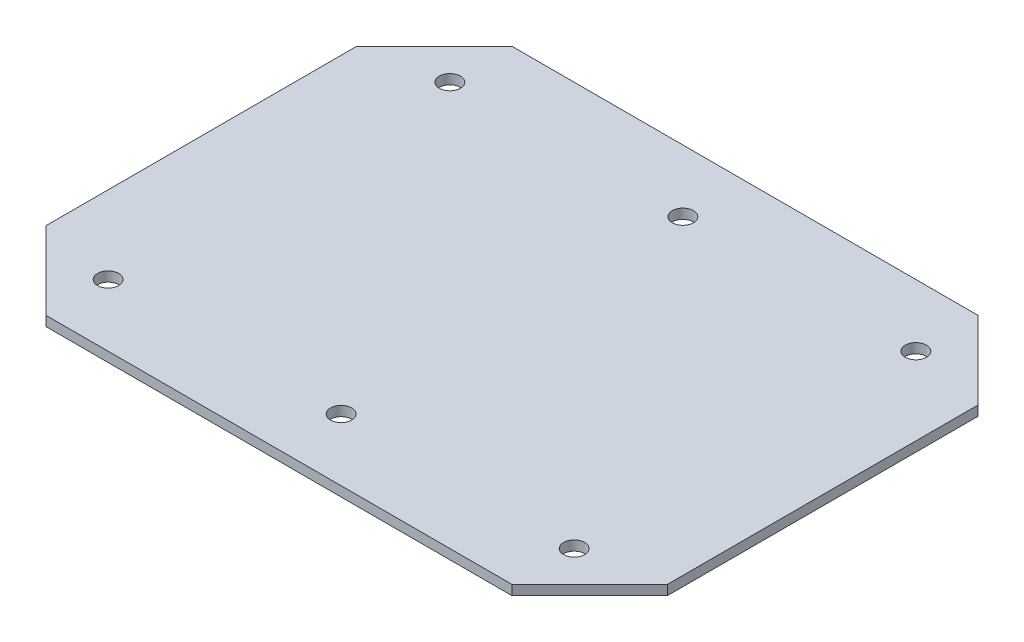
ISO-10303-21;
HEADER;
FILE_DESCRIPTION(('STEP AP214'),'2;1');
FILE_NAME('part.step','',(''),(''),'','','');
FILE_SCHEMA(('AUTOMOTIVE_DESIGN { 1 0 10303 214 1 1 1 1 }'));
ENDSEC;
DATA;
#1=APPLICATION_CONTEXT('core data for automotive mechanical design processes');
#2=APPLICATION_PROTOCOL_DEFINITION('international standard','automotive_design',2000,#1);
#3=PRODUCT_CONTEXT('',#1,'mechanical');
#4=PRODUCT('Part','Part','',(#3));
#5=PRODUCT_RELATED_PRODUCT_CATEGORY('part','',(#4));
#6=PRODUCT_DEFINITION_FORMATION('','',#4);
#7=PRODUCT_DEFINITION_CONTEXT('part definition',#1,'design');
#8=PRODUCT_DEFINITION('design','',#6,#7);
#9=PRODUCT_DEFINITION_SHAPE('','',#8);
#10=(LENGTH_UNIT() NAMED_UNIT(*) SI_UNIT(.MILLI.,.METRE.));
#11=(NAMED_UNIT(*) PLANE_ANGLE_UNIT() SI_UNIT($,.RADIAN.));
#12=(NAMED_UNIT(*) SI_UNIT($,.STERADIAN.) SOLID_ANGLE_UNIT());
#13=UNCERTAINTY_MEASURE_WITH_UNIT(LENGTH_MEASURE(1.E-05),#10,'distance_accuracy_value','');
#14=(GEOMETRIC_REPRESENTATION_CONTEXT(3) GLOBAL_UNCERTAINTY_ASSIGNED_CONTEXT((#13)) GLOBAL_UNIT_ASSIGNED_CONTEXT((#10,
#11,#12)) REPRESENTATION_CONTEXT('',''));
#15=CARTESIAN_POINT('',(0.,0.,0.));
#16=DIRECTION('',(0.,0.,1.));
#17=DIRECTION('',(1.,0.,0.));
#18=AXIS2_PLACEMENT_3D('',#15,#16,#17);
#19=CARTESIAN_POINT('',(-50.8,1.600000102,-38.1));
#20=DIRECTION('',(1.,0.,0.));
#21=DIRECTION('',(0.,0.,-1.));
#22=AXIS2_PLACEMENT_3D('',#19,#20,#21);
#23=PLANE('',#22);
#24=DIRECTION('',(0.,0.,1.));
#25=VECTOR('',#24,1.);
#26=CARTESIAN_POINT('',(-50.8,1.600000102,-38.1));
#27=LINE('',#26,#25);
#28=CARTESIAN_POINT('',(-50.8,1.600000102,-25.4));
#29=VERTEX_POINT('',#28);
#30=CARTESIAN_POINT('',(-50.8,1.600000102,25.3999999999999));
#31=VERTEX_POINT('',#30);
#32=EDGE_CURVE('E127',#29,#31,#27,.T.);
#33=ORIENTED_EDGE('',*,*,#32,.F.);
#34=DIRECTION('',(0.,-1.,0.));
#35=VECTOR('',#34,1.);
#36=CARTESIAN_POINT('',(-50.8,1.600000102,-25.4));
#37=LINE('',#36,#35);
#38=CARTESIAN_POINT('',(-50.8,0.,-25.4));
#39=VERTEX_POINT('',#38);
#40=EDGE_CURVE('E11',#29,#39,#37,.T.);
#41=ORIENTED_EDGE('',*,*,#40,.T.);
#42=DIRECTION('',(0.,0.,1.));
#43=VECTOR('',#42,1.);
#44=CARTESIAN_POINT('',(-50.8,0.,-38.1));
#45=LINE('',#44,#43);
#46=CARTESIAN_POINT('',(-50.8,0.,25.3999999999999));
#47=VERTEX_POINT('',#46);
#48=EDGE_CURVE('E129',#39,#47,#45,.T.);
#49=ORIENTED_EDGE('',*,*,#48,.T.);
#50=DIRECTION('',(0.,1.,0.));
#51=VECTOR('',#50,1.);
#52=CARTESIAN_POINT('',(-50.8,1.600000102,25.4));
#53=LINE('',#52,#51);
#54=EDGE_CURVE('E40',#47,#31,#53,.T.);
#55=ORIENTED_EDGE('',*,*,#54,.T.);
#56=EDGE_LOOP('',(#33,#41,#49,#55));
#57=FACE_BOUND('',#56,.T.);
#58=ADVANCED_FACE('F32',(#57),#23,.F.);
#59=CARTESIAN_POINT('',(-50.8,1.600000102,38.1));
#60=DIRECTION('',(0.,0.,-1.));
#61=DIRECTION('',(-1.,0.,0.));
#62=AXIS2_PLACEMENT_3D('',#59,#60,#61);
#63=PLANE('',#62);
#64=DIRECTION('',(1.,0.,0.));
#65=VECTOR('',#64,1.);
#66=CARTESIAN_POINT('',(-50.8,0.,38.1));
#67=LINE('',#66,#65);
#68=CARTESIAN_POINT('',(-38.1,0.,38.1));
#69=VERTEX_POINT('',#68);
#70=CARTESIAN_POINT('',(38.1,0.,38.1));
#71=VERTEX_POINT('',#70);
#72=EDGE_CURVE('E125',#69,#71,#67,.T.);
#73=ORIENTED_EDGE('',*,*,#72,.T.);
#74=DIRECTION('',(0.,1.,0.));
#75=VECTOR('',#74,1.);
#76=CARTESIAN_POINT('',(38.1,1.600000102,38.1));
#77=LINE('',#76,#75);
#78=CARTESIAN_POINT('',(38.1,1.600000102,38.1));
#79=VERTEX_POINT('',#78);
#80=EDGE_CURVE('E104',#71,#79,#77,.T.);
#81=ORIENTED_EDGE('',*,*,#80,.T.);
#82=DIRECTION('',(1.,0.,0.));
#83=VECTOR('',#82,1.);
#84=CARTESIAN_POINT('',(-50.8,1.600000102,38.1));
#85=LINE('',#84,#83);
#86=CARTESIAN_POINT('',(-38.1,1.600000102,38.1));
#87=VERTEX_POINT('',#86);
#88=EDGE_CURVE('E165',#87,#79,#85,.T.);
#89=ORIENTED_EDGE('',*,*,#88,.F.);
#90=DIRECTION('',(0.,-1.,0.));
#91=VECTOR('',#90,1.);
#92=CARTESIAN_POINT('',(-38.1,1.600000102,38.1));
#93=LINE('',#92,#91);
#94=EDGE_CURVE('E109',#87,#69,#93,.T.);
#95=ORIENTED_EDGE('',*,*,#94,.T.);
#96=EDGE_LOOP('',(#73,#81,#89,#95));
#97=FACE_BOUND('',#96,.T.);
#98=ADVANCED_FACE('F169',(#97),#63,.F.);
#99=CARTESIAN_POINT('',(50.8,1.600000102,-38.1));
#100=DIRECTION('',(-1.,0.,0.));
#101=DIRECTION('',(0.,0.,1.));
#102=AXIS2_PLACEMENT_3D('',#99,#100,#101);
#103=PLANE('',#102);
#104=DIRECTION('',(0.,0.,-1.));
#105=VECTOR('',#104,1.);
#106=CARTESIAN_POINT('',(50.8,1.600000102,-38.1));
#107=LINE('',#106,#105);
#108=CARTESIAN_POINT('',(50.8,1.600000102,25.4));
#109=VERTEX_POINT('',#108);
#110=CARTESIAN_POINT('',(50.8,1.600000102,-25.3999999999999));
#111=VERTEX_POINT('',#110);
#112=EDGE_CURVE('E118',#109,#111,#107,.T.);
#113=ORIENTED_EDGE('',*,*,#112,.F.);
#114=DIRECTION('',(0.,-1.,0.));
#115=VECTOR('',#114,1.);
#116=CARTESIAN_POINT('',(50.8,1.600000102,25.4));
#117=LINE('',#116,#115);
#118=CARTESIAN_POINT('',(50.8,0.,25.4));
#119=VERTEX_POINT('',#118);
#120=EDGE_CURVE('E103',#109,#119,#117,.T.);
#121=ORIENTED_EDGE('',*,*,#120,.T.);
#122=DIRECTION('',(0.,0.,-1.));
#123=VECTOR('',#122,1.);
#124=CARTESIAN_POINT('',(50.8,0.,-38.1));
#125=LINE('',#124,#123);
#126=CARTESIAN_POINT('',(50.8,0.,-25.3999999999999));
#127=VERTEX_POINT('',#126);
#128=EDGE_CURVE('E116',#119,#127,#125,.T.);
#129=ORIENTED_EDGE('',*,*,#128,.T.);
#130=DIRECTION('',(0.,1.,0.));
#131=VECTOR('',#130,1.);
#132=CARTESIAN_POINT('',(50.8,1.600000102,-25.3999999999999));
#133=LINE('',#132,#131);
#134=EDGE_CURVE('E120',#127,#111,#133,.T.);
#135=ORIENTED_EDGE('',*,*,#134,.T.);
#136=EDGE_LOOP('',(#113,#121,#129,#135));
#137=FACE_BOUND('',#136,.T.);
#138=ADVANCED_FACE('F115',(#137),#103,.F.);
#139=CARTESIAN_POINT('',(-50.8,1.600000102,-38.1));
#140=DIRECTION('',(0.,0.,1.));
#141=DIRECTION('',(1.,0.,0.));
#142=AXIS2_PLACEMENT_3D('',#139,#140,#141);
#143=PLANE('',#142);
#144=DIRECTION('',(-1.,0.,0.));
#145=VECTOR('',#144,1.);
#146=CARTESIAN_POINT('',(-50.8,1.600000102,-38.1));
#147=LINE('',#146,#145);
#148=CARTESIAN_POINT('',(38.1,1.600000102,-38.1));
#149=VERTEX_POINT('',#148);
#150=CARTESIAN_POINT('',(-38.0999999999999,1.600000102,-38.1));
#151=VERTEX_POINT('',#150);
#152=EDGE_CURVE('E133',#149,#151,#147,.T.);
#153=ORIENTED_EDGE('',*,*,#152,.F.);
#154=DIRECTION('',(0.,-1.,0.));
#155=VECTOR('',#154,1.);
#156=CARTESIAN_POINT('',(38.1,1.600000102,-38.1));
#157=LINE('',#156,#155);
#158=CARTESIAN_POINT('',(38.1,0.,-38.1));
#159=VERTEX_POINT('',#158);
#160=EDGE_CURVE('E150',#149,#159,#157,.T.);
#161=ORIENTED_EDGE('',*,*,#160,.T.);
#162=DIRECTION('',(-1.,0.,0.));
#163=VECTOR('',#162,1.);
#164=CARTESIAN_POINT('',(-50.8,0.,-38.1));
#165=LINE('',#164,#163);
#166=CARTESIAN_POINT('',(-38.0999999999999,0.,-38.1));
#167=VERTEX_POINT('',#166);
#168=EDGE_CURVE('E124',#159,#167,#165,.T.);
#169=ORIENTED_EDGE('',*,*,#168,.T.);
#170=DIRECTION('',(0.,1.,0.));
#171=VECTOR('',#170,1.);
#172=CARTESIAN_POINT('',(-38.0999999999999,1.600000102,-38.1));
#173=LINE('',#172,#171);
#174=EDGE_CURVE('E47',#167,#151,#173,.T.);
#175=ORIENTED_EDGE('',*,*,#174,.T.);
#176=EDGE_LOOP('',(#153,#161,#169,#175));
#177=FACE_BOUND('',#176,.T.);
#178=ADVANCED_FACE('F215',(#177),#143,.F.);
#179=CARTESIAN_POINT('',(0.,1.600000102,0.));
#180=DIRECTION('',(0.,1.,0.));
#181=DIRECTION('',(0.,0.,1.));
#182=AXIS2_PLACEMENT_3D('',#179,#180,#181);
#183=PLANE('',#182);
#184=CARTESIAN_POINT('',(38.1,1.600000102,27.94));
#185=DIRECTION('',(0.,1.,0.));
#186=DIRECTION('',(0.,0.,1.));
#187=AXIS2_PLACEMENT_3D('',#184,#185,#186);
#188=CIRCLE('',#187,1.72719999999998);
#189=CARTESIAN_POINT('',(38.1,1.600000102,29.6672));
#190=VERTEX_POINT('',#189);
#191=EDGE_CURVE('E207',#190,#190,#188,.T.);
#192=ORIENTED_EDGE('',*,*,#191,.F.);
#193=EDGE_LOOP('',(#192));
#194=FACE_BOUND('',#193,.T.);
#195=CARTESIAN_POINT('',(-38.1,1.600000102,27.94));
#196=DIRECTION('',(0.,1.,0.));
#197=DIRECTION('',(0.,0.,1.));
#198=AXIS2_PLACEMENT_3D('',#195,#196,#197);
#199=CIRCLE('',#198,1.72719999999998);
#200=CARTESIAN_POINT('',(-38.1,1.600000102,29.6672));
#201=VERTEX_POINT('',#200);
#202=EDGE_CURVE('E201',#201,#201,#199,.T.);
#203=ORIENTED_EDGE('',*,*,#202,.F.);
#204=EDGE_LOOP('',(#203));
#205=FACE_BOUND('',#204,.T.);
#206=CARTESIAN_POINT('',(0.,1.600000102,27.94));
#207=DIRECTION('',(0.,1.,0.));
#208=DIRECTION('',(0.,0.,1.));
#209=AXIS2_PLACEMENT_3D('',#206,#207,#208);
#210=CIRCLE('',#209,1.72719999999999);
#211=CARTESIAN_POINT('',(0.,1.600000102,29.6672));
#212=VERTEX_POINT('',#211);
#213=EDGE_CURVE('E195',#212,#212,#210,.T.);
#214=ORIENTED_EDGE('',*,*,#213,.F.);
#215=EDGE_LOOP('',(#214));
#216=FACE_BOUND('',#215,.T.);
#217=CARTESIAN_POINT('',(38.1,1.600000102,-27.94));
#218=DIRECTION('',(0.,1.,0.));
#219=DIRECTION('',(0.,0.,1.));
#220=AXIS2_PLACEMENT_3D('',#217,#218,#219);
#221=CIRCLE('',#220,1.72719999999998);
#222=CARTESIAN_POINT('',(38.1,1.600000102,-26.2128));
#223=VERTEX_POINT('',#222);
#224=EDGE_CURVE('E189',#223,#223,#221,.T.);
#225=ORIENTED_EDGE('',*,*,#224,.F.);
#226=EDGE_LOOP('',(#225));
#227=FACE_BOUND('',#226,.T.);
#228=CARTESIAN_POINT('',(0.,1.600000102,-27.94));
#229=DIRECTION('',(0.,1.,0.));
#230=DIRECTION('',(0.,0.,1.));
#231=AXIS2_PLACEMENT_3D('',#228,#229,#230);
#232=CIRCLE('',#231,1.72719999999999);
#233=CARTESIAN_POINT('',(0.,1.600000102,-26.2128));
#234=VERTEX_POINT('',#233);
#235=EDGE_CURVE('E183',#234,#234,#232,.T.);
#236=ORIENTED_EDGE('',*,*,#235,.F.);
#237=EDGE_LOOP('',(#236));
#238=FACE_BOUND('',#237,.T.);
#239=CARTESIAN_POINT('',(-38.1,1.600000102,-27.94));
#240=DIRECTION('',(0.,1.,0.));
#241=DIRECTION('',(0.,0.,1.));
#242=AXIS2_PLACEMENT_3D('',#239,#240,#241);
#243=CIRCLE('',#242,1.72719999999998);
#244=CARTESIAN_POINT('',(-38.1,1.600000102,-26.2128));
#245=VERTEX_POINT('',#244);
#246=EDGE_CURVE('E172',#245,#245,#243,.T.);
#247=ORIENTED_EDGE('',*,*,#246,.F.);
#248=EDGE_LOOP('',(#247));
#249=FACE_BOUND('',#248,.T.);
#250=ORIENTED_EDGE('',*,*,#88,.T.);
#251=DIRECTION('',(-0.707106781186549,0.,0.707106781186547));
#252=VECTOR('',#251,1.);
#253=CARTESIAN_POINT('',(38.0999999999999,1.600000102,38.1000000000001));
#254=LINE('',#253,#252);
#255=EDGE_CURVE('E147',#79,#109,#254,.F.);
#256=ORIENTED_EDGE('',*,*,#255,.T.);
#257=ORIENTED_EDGE('',*,*,#112,.T.);
#258=DIRECTION('',(0.707106781186547,0.,0.707106781186548));
#259=VECTOR('',#258,1.);
#260=CARTESIAN_POINT('',(38.1,1.600000102,-38.0999999999999));
#261=LINE('',#260,#259);
#262=EDGE_CURVE('E54',#111,#149,#261,.F.);
#263=ORIENTED_EDGE('',*,*,#262,.T.);
#264=ORIENTED_EDGE('',*,*,#152,.T.);
#265=DIRECTION('',(0.707106781186549,0.,-0.707106781186546));
#266=VECTOR('',#265,1.);
#267=CARTESIAN_POINT('',(-38.0999999999999,1.600000102,-38.1));
#268=LINE('',#267,#266);
#269=EDGE_CURVE('E144',#151,#29,#268,.F.);
#270=ORIENTED_EDGE('',*,*,#269,.T.);
#271=ORIENTED_EDGE('',*,*,#32,.T.);
#272=DIRECTION('',(-0.707106781186547,0.,-0.707106781186548));
#273=VECTOR('',#272,1.);
#274=CARTESIAN_POINT('',(-38.1,1.600000102,38.0999999999999));
#275=LINE('',#274,#273);
#276=EDGE_CURVE('E142',#31,#87,#275,.F.);
#277=ORIENTED_EDGE('',*,*,#276,.T.);
#278=EDGE_LOOP('',(#250,#256,#257,#263,#264,#270,#271,#277));
#279=FACE_BOUND('',#278,.T.);
#280=ADVANCED_FACE('F162',(#194,#205,#216,#227,#238,#249,#279),#183,.T.);
#281=CARTESIAN_POINT('',(0.,0.,0.));
#282=DIRECTION('',(0.,1.,0.));
#283=DIRECTION('',(0.,0.,1.));
#284=AXIS2_PLACEMENT_3D('',#281,#282,#283);
#285=PLANE('',#284);
#286=CARTESIAN_POINT('',(38.1,0.,27.94));
#287=DIRECTION('',(0.,1.,0.));
#288=DIRECTION('',(0.,0.,1.));
#289=AXIS2_PLACEMENT_3D('',#286,#287,#288);
#290=CIRCLE('',#289,1.7272);
#291=CARTESIAN_POINT('',(38.1,0.,29.6672));
#292=VERTEX_POINT('',#291);
#293=EDGE_CURVE('E204',#292,#292,#290,.T.);
#294=ORIENTED_EDGE('',*,*,#293,.T.);
#295=EDGE_LOOP('',(#294));
#296=FACE_BOUND('',#295,.T.);
#297=CARTESIAN_POINT('',(-38.1,0.,27.94));
#298=DIRECTION('',(0.,1.,0.));
#299=DIRECTION('',(0.,0.,1.));
#300=AXIS2_PLACEMENT_3D('',#297,#298,#299);
#301=CIRCLE('',#300,1.7272);
#302=CARTESIAN_POINT('',(-38.1,0.,29.6672));
#303=VERTEX_POINT('',#302);
#304=EDGE_CURVE('E198',#303,#303,#301,.T.);
#305=ORIENTED_EDGE('',*,*,#304,.T.);
#306=EDGE_LOOP('',(#305));
#307=FACE_BOUND('',#306,.T.);
#308=CARTESIAN_POINT('',(0.,0.,27.94));
#309=DIRECTION('',(0.,1.,0.));
#310=DIRECTION('',(0.,0.,1.));
#311=AXIS2_PLACEMENT_3D('',#308,#309,#310);
#312=CIRCLE('',#311,1.7272);
#313=CARTESIAN_POINT('',(0.,0.,29.6672));
#314=VERTEX_POINT('',#313);
#315=EDGE_CURVE('E192',#314,#314,#312,.T.);
#316=ORIENTED_EDGE('',*,*,#315,.T.);
#317=EDGE_LOOP('',(#316));
#318=FACE_BOUND('',#317,.T.);
#319=CARTESIAN_POINT('',(38.1,0.,-27.94));
#320=DIRECTION('',(0.,1.,0.));
#321=DIRECTION('',(0.,0.,1.));
#322=AXIS2_PLACEMENT_3D('',#319,#320,#321);
#323=CIRCLE('',#322,1.7272);
#324=CARTESIAN_POINT('',(38.1,0.,-26.2128));
#325=VERTEX_POINT('',#324);
#326=EDGE_CURVE('E186',#325,#325,#323,.T.);
#327=ORIENTED_EDGE('',*,*,#326,.T.);
#328=EDGE_LOOP('',(#327));
#329=FACE_BOUND('',#328,.T.);
#330=CARTESIAN_POINT('',(0.,0.,-27.94));
#331=DIRECTION('',(0.,1.,0.));
#332=DIRECTION('',(0.,0.,1.));
#333=AXIS2_PLACEMENT_3D('',#330,#331,#332);
#334=CIRCLE('',#333,1.7272);
#335=CARTESIAN_POINT('',(0.,0.,-26.2128));
#336=VERTEX_POINT('',#335);
#337=EDGE_CURVE('E180',#336,#336,#334,.T.);
#338=ORIENTED_EDGE('',*,*,#337,.T.);
#339=EDGE_LOOP('',(#338));
#340=FACE_BOUND('',#339,.T.);
#341=CARTESIAN_POINT('',(-38.1,0.,-27.94));
#342=DIRECTION('',(0.,1.,0.));
#343=DIRECTION('',(0.,0.,1.));
#344=AXIS2_PLACEMENT_3D('',#341,#342,#343);
#345=CIRCLE('',#344,1.7272);
#346=CARTESIAN_POINT('',(-38.1,0.,-26.2128));
#347=VERTEX_POINT('',#346);
#348=EDGE_CURVE('E170',#347,#347,#345,.T.);
#349=ORIENTED_EDGE('',*,*,#348,.T.);
#350=EDGE_LOOP('',(#349));
#351=FACE_BOUND('',#350,.T.);
#352=ORIENTED_EDGE('',*,*,#128,.F.);
#353=DIRECTION('',(0.707106781186549,0.,-0.707106781186547));
#354=VECTOR('',#353,1.);
#355=CARTESIAN_POINT('',(50.8,0.,25.4));
#356=LINE('',#355,#354);
#357=EDGE_CURVE('E99',#119,#71,#356,.F.);
#358=ORIENTED_EDGE('',*,*,#357,.T.);
#359=ORIENTED_EDGE('',*,*,#72,.F.);
#360=DIRECTION('',(0.707106781186547,0.,0.707106781186548));
#361=VECTOR('',#360,1.);
#362=CARTESIAN_POINT('',(-38.1,0.,38.1));
#363=LINE('',#362,#361);
#364=EDGE_CURVE('E119',#69,#47,#363,.F.);
#365=ORIENTED_EDGE('',*,*,#364,.T.);
#366=ORIENTED_EDGE('',*,*,#48,.F.);
#367=DIRECTION('',(-0.707106781186549,0.,0.707106781186546));
#368=VECTOR('',#367,1.);
#369=CARTESIAN_POINT('',(-50.8,0.,-25.4));
#370=LINE('',#369,#368);
#371=EDGE_CURVE('E136',#39,#167,#370,.F.);
#372=ORIENTED_EDGE('',*,*,#371,.T.);
#373=ORIENTED_EDGE('',*,*,#168,.F.);
#374=DIRECTION('',(-0.707106781186547,0.,-0.707106781186548));
#375=VECTOR('',#374,1.);
#376=CARTESIAN_POINT('',(38.1,0.,-38.1));
#377=LINE('',#376,#375);
#378=EDGE_CURVE('E110',#159,#127,#377,.F.);
#379=ORIENTED_EDGE('',*,*,#378,.T.);
#380=EDGE_LOOP('',(#352,#358,#359,#365,#366,#372,#373,#379));
#381=FACE_BOUND('',#380,.T.);
#382=ADVANCED_FACE('F122',(#296,#307,#318,#329,#340,#351,#381),#285,.F.);
#383=CARTESIAN_POINT('',(-38.1,1.600000102,-27.94));
#384=DIRECTION('',(0.,1.,0.));
#385=DIRECTION('',(0.,0.,1.));
#386=AXIS2_PLACEMENT_3D('',#383,#384,#385);
#387=CYLINDRICAL_SURFACE('',#386,1.72719999999999);
#388=ORIENTED_EDGE('',*,*,#348,.F.);
#389=EDGE_LOOP('',(#388));
#390=FACE_BOUND('',#389,.T.);
#391=ORIENTED_EDGE('',*,*,#246,.T.);
#392=EDGE_LOOP('',(#391));
#393=FACE_BOUND('',#392,.T.);
#394=ADVANCED_FACE('F227',(#390,#393),#387,.F.);
#395=CARTESIAN_POINT('',(0.,1.600000102,-27.94));
#396=DIRECTION('',(0.,1.,0.));
#397=DIRECTION('',(0.,0.,1.));
#398=AXIS2_PLACEMENT_3D('',#395,#396,#397);
#399=CYLINDRICAL_SURFACE('',#398,1.72719999999999);
#400=ORIENTED_EDGE('',*,*,#337,.F.);
#401=EDGE_LOOP('',(#400));
#402=FACE_BOUND('',#401,.T.);
#403=ORIENTED_EDGE('',*,*,#235,.T.);
#404=EDGE_LOOP('',(#403));
#405=FACE_BOUND('',#404,.T.);
#406=ADVANCED_FACE('F229',(#402,#405),#399,.F.);
#407=CARTESIAN_POINT('',(38.1,1.600000102,-27.94));
#408=DIRECTION('',(0.,1.,0.));
#409=DIRECTION('',(0.,0.,1.));
#410=AXIS2_PLACEMENT_3D('',#407,#408,#409);
#411=CYLINDRICAL_SURFACE('',#410,1.72719999999999);
#412=ORIENTED_EDGE('',*,*,#326,.F.);
#413=EDGE_LOOP('',(#412));
#414=FACE_BOUND('',#413,.T.);
#415=ORIENTED_EDGE('',*,*,#224,.T.);
#416=EDGE_LOOP('',(#415));
#417=FACE_BOUND('',#416,.T.);
#418=ADVANCED_FACE('F236',(#414,#417),#411,.F.);
#419=CARTESIAN_POINT('',(0.,1.600000102,27.94));
#420=DIRECTION('',(0.,1.,0.));
#421=DIRECTION('',(0.,0.,1.));
#422=AXIS2_PLACEMENT_3D('',#419,#420,#421);
#423=CYLINDRICAL_SURFACE('',#422,1.72719999999999);
#424=ORIENTED_EDGE('',*,*,#315,.F.);
#425=EDGE_LOOP('',(#424));
#426=FACE_BOUND('',#425,.T.);
#427=ORIENTED_EDGE('',*,*,#213,.T.);
#428=EDGE_LOOP('',(#427));
#429=FACE_BOUND('',#428,.T.);
#430=ADVANCED_FACE('F338',(#426,#429),#423,.F.);
#431=CARTESIAN_POINT('',(-38.1,1.600000102,27.94));
#432=DIRECTION('',(0.,1.,0.));
#433=DIRECTION('',(0.,0.,1.));
#434=AXIS2_PLACEMENT_3D('',#431,#432,#433);
#435=CYLINDRICAL_SURFACE('',#434,1.72719999999999);
#436=ORIENTED_EDGE('',*,*,#304,.F.);
#437=EDGE_LOOP('',(#436));
#438=FACE_BOUND('',#437,.T.);
#439=ORIENTED_EDGE('',*,*,#202,.T.);
#440=EDGE_LOOP('',(#439));
#441=FACE_BOUND('',#440,.T.);
#442=ADVANCED_FACE('F347',(#438,#441),#435,.F.);
#443=CARTESIAN_POINT('',(38.1,1.600000102,27.94));
#444=DIRECTION('',(0.,1.,0.));
#445=DIRECTION('',(0.,0.,1.));
#446=AXIS2_PLACEMENT_3D('',#443,#444,#445);
#447=CYLINDRICAL_SURFACE('',#446,1.72719999999999);
#448=ORIENTED_EDGE('',*,*,#293,.F.);
#449=EDGE_LOOP('',(#448));
#450=FACE_BOUND('',#449,.T.);
#451=ORIENTED_EDGE('',*,*,#191,.T.);
#452=EDGE_LOOP('',(#451));
#453=FACE_BOUND('',#452,.T.);
#454=ADVANCED_FACE('F211',(#450,#453),#447,.F.);
#455=CARTESIAN_POINT('',(50.8,1.600000102,25.4));
#456=DIRECTION('',(-0.707106781186547,0.,-0.707106781186549));
#457=DIRECTION('',(0.,-1.,0.));
#458=AXIS2_PLACEMENT_3D('',#455,#456,#457);
#459=PLANE('',#458);
#460=ORIENTED_EDGE('',*,*,#255,.F.);
#461=ORIENTED_EDGE('',*,*,#80,.F.);
#462=ORIENTED_EDGE('',*,*,#357,.F.);
#463=ORIENTED_EDGE('',*,*,#120,.F.);
#464=EDGE_LOOP('',(#460,#461,#462,#463));
#465=FACE_BOUND('',#464,.T.);
#466=ADVANCED_FACE('F102',(#465),#459,.F.);
#467=CARTESIAN_POINT('',(38.1,1.600000102,-38.1));
#468=DIRECTION('',(-0.707106781186548,0.,0.707106781186547));
#469=DIRECTION('',(0.,-1.,0.));
#470=AXIS2_PLACEMENT_3D('',#467,#468,#469);
#471=PLANE('',#470);
#472=ORIENTED_EDGE('',*,*,#262,.F.);
#473=ORIENTED_EDGE('',*,*,#134,.F.);
#474=ORIENTED_EDGE('',*,*,#378,.F.);
#475=ORIENTED_EDGE('',*,*,#160,.F.);
#476=EDGE_LOOP('',(#472,#473,#474,#475));
#477=FACE_BOUND('',#476,.T.);
#478=ADVANCED_FACE('F254',(#477),#471,.F.);
#479=CARTESIAN_POINT('',(-50.8,1.600000102,-25.4));
#480=DIRECTION('',(0.707106781186546,0.,0.707106781186549));
#481=DIRECTION('',(0.,-1.,0.));
#482=AXIS2_PLACEMENT_3D('',#479,#480,#481);
#483=PLANE('',#482);
#484=ORIENTED_EDGE('',*,*,#269,.F.);
#485=ORIENTED_EDGE('',*,*,#174,.F.);
#486=ORIENTED_EDGE('',*,*,#371,.F.);
#487=ORIENTED_EDGE('',*,*,#40,.F.);
#488=EDGE_LOOP('',(#484,#485,#486,#487));
#489=FACE_BOUND('',#488,.T.);
#490=ADVANCED_FACE('F256',(#489),#483,.F.);
#491=CARTESIAN_POINT('',(-38.1,1.600000102,38.1));
#492=DIRECTION('',(0.707106781186548,0.,-0.707106781186547));
#493=DIRECTION('',(0.,-1.,0.));
#494=AXIS2_PLACEMENT_3D('',#491,#492,#493);
#495=PLANE('',#494);
#496=ORIENTED_EDGE('',*,*,#276,.F.);
#497=ORIENTED_EDGE('',*,*,#54,.F.);
#498=ORIENTED_EDGE('',*,*,#364,.F.);
#499=ORIENTED_EDGE('',*,*,#94,.F.);
#500=EDGE_LOOP('',(#496,#497,#498,#499));
#501=FACE_BOUND('',#500,.T.);
#502=ADVANCED_FACE('F34',(#501),#495,.F.);
#503=CLOSED_SHELL('',(#58,#98,#138,#178,#280,#382,#394,#406,#418,#430,#442,#454,#466,#478,#490,#502));
#504=MANIFOLD_SOLID_BREP('B2',#503);
#505=ADVANCED_BREP_SHAPE_REPRESENTATION('',(#18,#504),#14);
#506=SHAPE_DEFINITION_REPRESENTATION(#9,#505);
ENDSEC;
END-ISO-10303-21;
